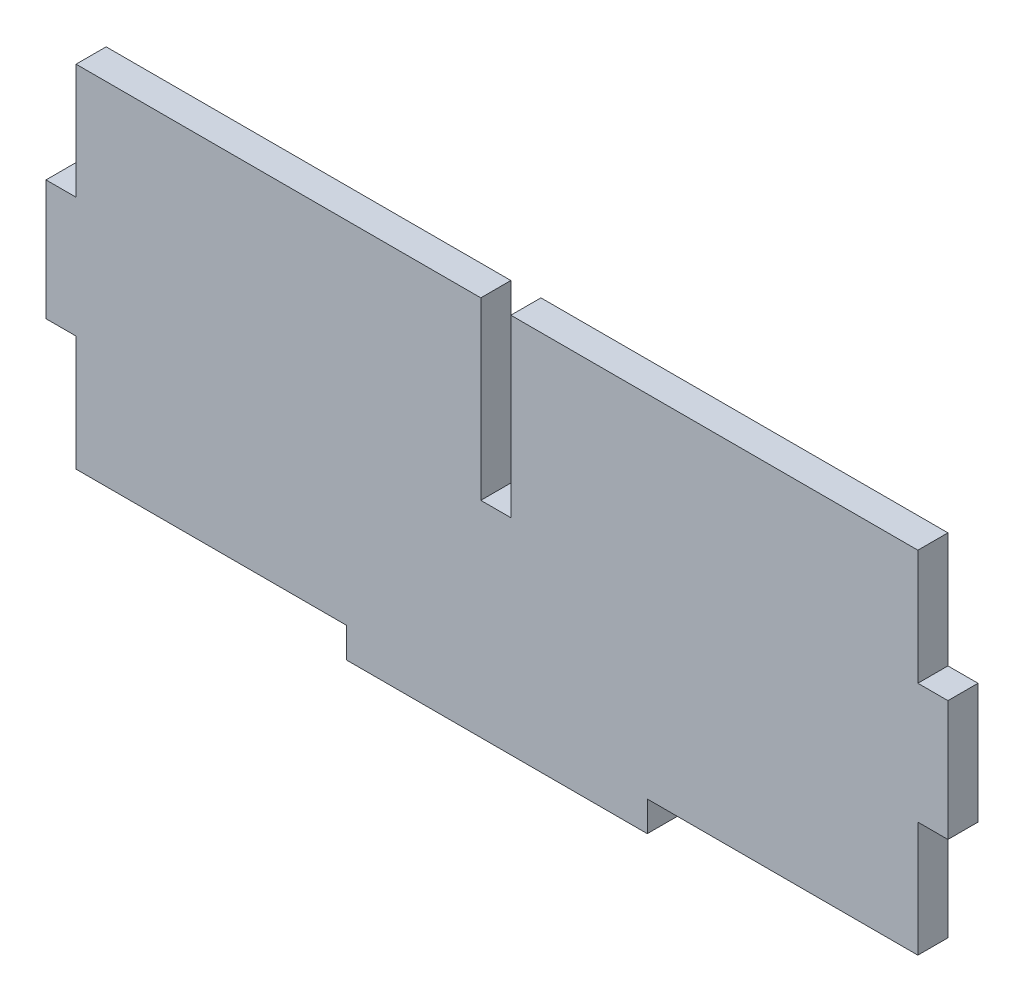
ISO-10303-21;
HEADER;
FILE_DESCRIPTION(('STEP AP214'),'2;1');
FILE_NAME('part.step','',(''),(''),'','','');
FILE_SCHEMA(('AUTOMOTIVE_DESIGN { 1 0 10303 214 1 1 1 1 }'));
ENDSEC;
DATA;
#1=APPLICATION_CONTEXT('core data for automotive mechanical design processes');
#2=APPLICATION_PROTOCOL_DEFINITION('international standard','automotive_design',2000,#1);
#3=PRODUCT_CONTEXT('',#1,'mechanical');
#4=PRODUCT('Part','Part','',(#3));
#5=PRODUCT_RELATED_PRODUCT_CATEGORY('part','',(#4));
#6=PRODUCT_DEFINITION_FORMATION('','',#4);
#7=PRODUCT_DEFINITION_CONTEXT('part definition',#1,'design');
#8=PRODUCT_DEFINITION('design','',#6,#7);
#9=PRODUCT_DEFINITION_SHAPE('','',#8);
#10=(LENGTH_UNIT() NAMED_UNIT(*) SI_UNIT(.MILLI.,.METRE.));
#11=(NAMED_UNIT(*) PLANE_ANGLE_UNIT() SI_UNIT($,.RADIAN.));
#12=(NAMED_UNIT(*) SI_UNIT($,.STERADIAN.) SOLID_ANGLE_UNIT());
#13=UNCERTAINTY_MEASURE_WITH_UNIT(LENGTH_MEASURE(1.E-05),#10,'distance_accuracy_value','');
#14=(GEOMETRIC_REPRESENTATION_CONTEXT(3) GLOBAL_UNCERTAINTY_ASSIGNED_CONTEXT((#13)) GLOBAL_UNIT_ASSIGNED_CONTEXT((#10,
#11,#12)) REPRESENTATION_CONTEXT('',''));
#15=CARTESIAN_POINT('',(0.,0.,0.));
#16=DIRECTION('',(0.,0.,1.));
#17=DIRECTION('',(1.,0.,0.));
#18=AXIS2_PLACEMENT_3D('',#15,#16,#17);
#19=CARTESIAN_POINT('',(1.38702054479395,0.,3.));
#20=DIRECTION('',(-1.,0.,0.));
#21=DIRECTION('',(0.,0.,1.));
#22=AXIS2_PLACEMENT_3D('',#19,#20,#21);
#23=PLANE('',#22);
#24=DIRECTION('',(0.,1.,0.));
#25=VECTOR('',#24,1.);
#26=CARTESIAN_POINT('',(1.38702054479395,0.,0.));
#27=LINE('',#26,#25);
#28=CARTESIAN_POINT('',(1.38702054479395,1.5,0.));
#29=VERTEX_POINT('',#28);
#30=CARTESIAN_POINT('',(1.38702054479395,19.,0.));
#31=VERTEX_POINT('',#30);
#32=EDGE_CURVE('E201',#29,#31,#27,.T.);
#33=ORIENTED_EDGE('',*,*,#32,.F.);
#34=DIRECTION('',(0.,0.,-1.));
#35=VECTOR('',#34,1.);
#36=CARTESIAN_POINT('',(1.38702054479395,1.5,3.));
#37=LINE('',#36,#35);
#38=CARTESIAN_POINT('',(1.38702054479395,1.5,3.));
#39=VERTEX_POINT('',#38);
#40=EDGE_CURVE('E11',#39,#29,#37,.T.);
#41=ORIENTED_EDGE('',*,*,#40,.F.);
#42=DIRECTION('',(0.,1.,0.));
#43=VECTOR('',#42,1.);
#44=CARTESIAN_POINT('',(1.38702054479395,0.,3.));
#45=LINE('',#44,#43);
#46=CARTESIAN_POINT('',(1.38702054479395,19.,3.));
#47=VERTEX_POINT('',#46);
#48=EDGE_CURVE('E301',#39,#47,#45,.T.);
#49=ORIENTED_EDGE('',*,*,#48,.T.);
#50=DIRECTION('',(0.,0.,-1.));
#51=VECTOR('',#50,1.);
#52=CARTESIAN_POINT('',(1.38702054479395,19.,3.));
#53=LINE('',#52,#51);
#54=EDGE_CURVE('E50',#47,#31,#53,.T.);
#55=ORIENTED_EDGE('',*,*,#54,.T.);
#56=EDGE_LOOP('',(#33,#41,#49,#55));
#57=FACE_BOUND('',#56,.T.);
#58=ADVANCED_FACE('F34',(#57),#23,.T.);
#59=CARTESIAN_POINT('',(0.,1.5,3.));
#60=DIRECTION('',(0.,1.,0.));
#61=DIRECTION('',(0.,0.,1.));
#62=AXIS2_PLACEMENT_3D('',#59,#60,#61);
#63=PLANE('',#62);
#64=DIRECTION('',(1.,0.,0.));
#65=VECTOR('',#64,1.);
#66=CARTESIAN_POINT('',(0.,1.5,0.));
#67=LINE('',#66,#65);
#68=CARTESIAN_POINT('',(-1.61297945520605,1.5,0.));
#69=VERTEX_POINT('',#68);
#70=EDGE_CURVE('E203',#69,#29,#67,.T.);
#71=ORIENTED_EDGE('',*,*,#70,.F.);
#72=DIRECTION('',(0.,0.,-1.));
#73=VECTOR('',#72,1.);
#74=CARTESIAN_POINT('',(-1.61297945520605,1.5,3.));
#75=LINE('',#74,#73);
#76=CARTESIAN_POINT('',(-1.61297945520605,1.5,3.));
#77=VERTEX_POINT('',#76);
#78=EDGE_CURVE('E42',#77,#69,#75,.T.);
#79=ORIENTED_EDGE('',*,*,#78,.F.);
#80=DIRECTION('',(1.,0.,0.));
#81=VECTOR('',#80,1.);
#82=CARTESIAN_POINT('',(0.,1.5,3.));
#83=LINE('',#82,#81);
#84=EDGE_CURVE('E298',#77,#39,#83,.T.);
#85=ORIENTED_EDGE('',*,*,#84,.T.);
#86=ORIENTED_EDGE('',*,*,#40,.T.);
#87=EDGE_LOOP('',(#71,#79,#85,#86));
#88=FACE_BOUND('',#87,.T.);
#89=ADVANCED_FACE('F297',(#88),#63,.T.);
#90=CARTESIAN_POINT('',(-1.61297945520605,0.,3.));
#91=DIRECTION('',(-1.,0.,0.));
#92=DIRECTION('',(0.,0.,1.));
#93=AXIS2_PLACEMENT_3D('',#90,#91,#92);
#94=PLANE('',#93);
#95=DIRECTION('',(0.,1.,0.));
#96=VECTOR('',#95,1.);
#97=CARTESIAN_POINT('',(-1.61297945520605,0.,0.));
#98=LINE('',#97,#96);
#99=CARTESIAN_POINT('',(-1.61297945520605,19.,0.));
#100=VERTEX_POINT('',#99);
#101=EDGE_CURVE('E206',#69,#100,#98,.T.);
#102=ORIENTED_EDGE('',*,*,#101,.T.);
#103=DIRECTION('',(0.,0.,-1.));
#104=VECTOR('',#103,1.);
#105=CARTESIAN_POINT('',(-1.61297945520605,19.,3.));
#106=LINE('',#105,#104);
#107=CARTESIAN_POINT('',(-1.61297945520605,19.,3.));
#108=VERTEX_POINT('',#107);
#109=EDGE_CURVE('E283',#108,#100,#106,.T.);
#110=ORIENTED_EDGE('',*,*,#109,.F.);
#111=DIRECTION('',(0.,1.,0.));
#112=VECTOR('',#111,1.);
#113=CARTESIAN_POINT('',(-1.61297945520605,0.,3.));
#114=LINE('',#113,#112);
#115=EDGE_CURVE('E289',#77,#108,#114,.T.);
#116=ORIENTED_EDGE('',*,*,#115,.F.);
#117=ORIENTED_EDGE('',*,*,#78,.T.);
#118=EDGE_LOOP('',(#102,#110,#116,#117));
#119=FACE_BOUND('',#118,.T.);
#120=ADVANCED_FACE('F287',(#119),#94,.F.);
#121=CARTESIAN_POINT('',(0.,19.,3.));
#122=DIRECTION('',(0.,1.,0.));
#123=DIRECTION('',(0.,0.,1.));
#124=AXIS2_PLACEMENT_3D('',#121,#122,#123);
#125=PLANE('',#124);
#126=DIRECTION('',(1.,0.,0.));
#127=VECTOR('',#126,1.);
#128=CARTESIAN_POINT('',(0.,19.,0.));
#129=LINE('',#128,#127);
#130=CARTESIAN_POINT('',(-42.,19.,0.));
#131=VERTEX_POINT('',#130);
#132=EDGE_CURVE('E209',#131,#100,#129,.T.);
#133=ORIENTED_EDGE('',*,*,#132,.F.);
#134=DIRECTION('',(0.,0.,-1.));
#135=VECTOR('',#134,1.);
#136=CARTESIAN_POINT('',(-42.,19.,3.));
#137=LINE('',#136,#135);
#138=CARTESIAN_POINT('',(-42.,19.,3.));
#139=VERTEX_POINT('',#138);
#140=EDGE_CURVE('E281',#139,#131,#137,.T.);
#141=ORIENTED_EDGE('',*,*,#140,.F.);
#142=DIRECTION('',(1.,0.,0.));
#143=VECTOR('',#142,1.);
#144=CARTESIAN_POINT('',(0.,19.,3.));
#145=LINE('',#144,#143);
#146=EDGE_CURVE('E198',#139,#108,#145,.T.);
#147=ORIENTED_EDGE('',*,*,#146,.T.);
#148=ORIENTED_EDGE('',*,*,#109,.T.);
#149=EDGE_LOOP('',(#133,#141,#147,#148));
#150=FACE_BOUND('',#149,.T.);
#151=ADVANCED_FACE('F367',(#150),#125,.T.);
#152=CARTESIAN_POINT('',(-42.,0.,3.));
#153=DIRECTION('',(-1.,0.,0.));
#154=DIRECTION('',(0.,0.,1.));
#155=AXIS2_PLACEMENT_3D('',#152,#153,#154);
#156=PLANE('',#155);
#157=DIRECTION('',(0.,1.,0.));
#158=VECTOR('',#157,1.);
#159=CARTESIAN_POINT('',(-42.,0.,0.));
#160=LINE('',#159,#158);
#161=CARTESIAN_POINT('',(-42.,7.5,0.));
#162=VERTEX_POINT('',#161);
#163=EDGE_CURVE('E212',#162,#131,#160,.T.);
#164=ORIENTED_EDGE('',*,*,#163,.F.);
#165=DIRECTION('',(0.,0.,-1.));
#166=VECTOR('',#165,1.);
#167=CARTESIAN_POINT('',(-42.,7.5,3.));
#168=LINE('',#167,#166);
#169=CARTESIAN_POINT('',(-42.,7.5,3.));
#170=VERTEX_POINT('',#169);
#171=EDGE_CURVE('E279',#170,#162,#168,.T.);
#172=ORIENTED_EDGE('',*,*,#171,.F.);
#173=DIRECTION('',(0.,1.,0.));
#174=VECTOR('',#173,1.);
#175=CARTESIAN_POINT('',(-42.,0.,3.));
#176=LINE('',#175,#174);
#177=EDGE_CURVE('E307',#170,#139,#176,.T.);
#178=ORIENTED_EDGE('',*,*,#177,.T.);
#179=ORIENTED_EDGE('',*,*,#140,.T.);
#180=EDGE_LOOP('',(#164,#172,#178,#179));
#181=FACE_BOUND('',#180,.T.);
#182=ADVANCED_FACE('F370',(#181),#156,.T.);
#183=CARTESIAN_POINT('',(0.,7.50000000000002,3.));
#184=DIRECTION('',(0.,1.,0.));
#185=DIRECTION('',(-1.,0.,0.));
#186=AXIS2_PLACEMENT_3D('',#183,#184,#185);
#187=PLANE('',#186);
#188=DIRECTION('',(1.,0.,0.));
#189=VECTOR('',#188,1.);
#190=CARTESIAN_POINT('',(0.,7.50000000000002,0.));
#191=LINE('',#190,#189);
#192=CARTESIAN_POINT('',(-45.,7.5,0.));
#193=VERTEX_POINT('',#192);
#194=EDGE_CURVE('E216',#193,#162,#191,.T.);
#195=ORIENTED_EDGE('',*,*,#194,.F.);
#196=DIRECTION('',(0.,0.,-1.));
#197=VECTOR('',#196,1.);
#198=CARTESIAN_POINT('',(-45.,7.5,3.));
#199=LINE('',#198,#197);
#200=CARTESIAN_POINT('',(-45.,7.5,3.));
#201=VERTEX_POINT('',#200);
#202=EDGE_CURVE('E277',#201,#193,#199,.T.);
#203=ORIENTED_EDGE('',*,*,#202,.F.);
#204=DIRECTION('',(1.,0.,0.));
#205=VECTOR('',#204,1.);
#206=CARTESIAN_POINT('',(0.,7.50000000000002,3.));
#207=LINE('',#206,#205);
#208=EDGE_CURVE('E310',#201,#170,#207,.T.);
#209=ORIENTED_EDGE('',*,*,#208,.T.);
#210=ORIENTED_EDGE('',*,*,#171,.T.);
#211=EDGE_LOOP('',(#195,#203,#209,#210));
#212=FACE_BOUND('',#211,.T.);
#213=ADVANCED_FACE('F373',(#212),#187,.T.);
#214=CARTESIAN_POINT('',(-45.,0.,3.));
#215=DIRECTION('',(-1.,0.,0.));
#216=DIRECTION('',(0.,0.,1.));
#217=AXIS2_PLACEMENT_3D('',#214,#215,#216);
#218=PLANE('',#217);
#219=DIRECTION('',(0.,1.,0.));
#220=VECTOR('',#219,1.);
#221=CARTESIAN_POINT('',(-45.,0.,0.));
#222=LINE('',#221,#220);
#223=CARTESIAN_POINT('',(-45.,-4.5,0.));
#224=VERTEX_POINT('',#223);
#225=EDGE_CURVE('E219',#224,#193,#222,.T.);
#226=ORIENTED_EDGE('',*,*,#225,.F.);
#227=DIRECTION('',(0.,0.,-1.));
#228=VECTOR('',#227,1.);
#229=CARTESIAN_POINT('',(-45.,-4.5,3.));
#230=LINE('',#229,#228);
#231=CARTESIAN_POINT('',(-45.,-4.5,3.));
#232=VERTEX_POINT('',#231);
#233=EDGE_CURVE('E275',#232,#224,#230,.T.);
#234=ORIENTED_EDGE('',*,*,#233,.F.);
#235=DIRECTION('',(0.,1.,0.));
#236=VECTOR('',#235,1.);
#237=CARTESIAN_POINT('',(-45.,0.,3.));
#238=LINE('',#237,#236);
#239=EDGE_CURVE('E313',#232,#201,#238,.T.);
#240=ORIENTED_EDGE('',*,*,#239,.T.);
#241=ORIENTED_EDGE('',*,*,#202,.T.);
#242=EDGE_LOOP('',(#226,#234,#240,#241));
#243=FACE_BOUND('',#242,.T.);
#244=ADVANCED_FACE('F377',(#243),#218,.T.);
#245=CARTESIAN_POINT('',(0.,-4.49999999999998,3.));
#246=DIRECTION('',(0.,-1.,0.));
#247=DIRECTION('',(1.,0.,0.));
#248=AXIS2_PLACEMENT_3D('',#245,#246,#247);
#249=PLANE('',#248);
#250=DIRECTION('',(-1.,0.,0.));
#251=VECTOR('',#250,1.);
#252=CARTESIAN_POINT('',(0.,-4.49999999999998,0.));
#253=LINE('',#252,#251);
#254=CARTESIAN_POINT('',(-42.,-4.5,0.));
#255=VERTEX_POINT('',#254);
#256=EDGE_CURVE('E222',#255,#224,#253,.T.);
#257=ORIENTED_EDGE('',*,*,#256,.F.);
#258=DIRECTION('',(0.,0.,-1.));
#259=VECTOR('',#258,1.);
#260=CARTESIAN_POINT('',(-42.,-4.5,3.));
#261=LINE('',#260,#259);
#262=CARTESIAN_POINT('',(-42.,-4.5,3.));
#263=VERTEX_POINT('',#262);
#264=EDGE_CURVE('E273',#263,#255,#261,.T.);
#265=ORIENTED_EDGE('',*,*,#264,.F.);
#266=DIRECTION('',(-1.,0.,0.));
#267=VECTOR('',#266,1.);
#268=CARTESIAN_POINT('',(0.,-4.49999999999998,3.));
#269=LINE('',#268,#267);
#270=EDGE_CURVE('E316',#263,#232,#269,.T.);
#271=ORIENTED_EDGE('',*,*,#270,.T.);
#272=ORIENTED_EDGE('',*,*,#233,.T.);
#273=EDGE_LOOP('',(#257,#265,#271,#272));
#274=FACE_BOUND('',#273,.T.);
#275=ADVANCED_FACE('F381',(#274),#249,.T.);
#276=CARTESIAN_POINT('',(-42.,0.,3.));
#277=DIRECTION('',(-1.,0.,0.));
#278=DIRECTION('',(0.,0.,1.));
#279=AXIS2_PLACEMENT_3D('',#276,#277,#278);
#280=PLANE('',#279);
#281=DIRECTION('',(0.,1.,0.));
#282=VECTOR('',#281,1.);
#283=CARTESIAN_POINT('',(-42.,0.,0.));
#284=LINE('',#283,#282);
#285=CARTESIAN_POINT('',(-42.,-16.,0.));
#286=VERTEX_POINT('',#285);
#287=EDGE_CURVE('E225',#286,#255,#284,.T.);
#288=ORIENTED_EDGE('',*,*,#287,.F.);
#289=DIRECTION('',(0.,0.,-1.));
#290=VECTOR('',#289,1.);
#291=CARTESIAN_POINT('',(-42.,-16.,3.));
#292=LINE('',#291,#290);
#293=CARTESIAN_POINT('',(-42.,-16.,3.));
#294=VERTEX_POINT('',#293);
#295=EDGE_CURVE('E271',#294,#286,#292,.T.);
#296=ORIENTED_EDGE('',*,*,#295,.F.);
#297=DIRECTION('',(0.,1.,0.));
#298=VECTOR('',#297,1.);
#299=CARTESIAN_POINT('',(-42.,0.,3.));
#300=LINE('',#299,#298);
#301=EDGE_CURVE('E319',#294,#263,#300,.T.);
#302=ORIENTED_EDGE('',*,*,#301,.T.);
#303=ORIENTED_EDGE('',*,*,#264,.T.);
#304=EDGE_LOOP('',(#288,#296,#302,#303));
#305=FACE_BOUND('',#304,.T.);
#306=ADVANCED_FACE('F385',(#305),#280,.T.);
#307=CARTESIAN_POINT('',(0.,-16.,3.));
#308=DIRECTION('',(0.,1.,0.));
#309=DIRECTION('',(0.,0.,1.));
#310=AXIS2_PLACEMENT_3D('',#307,#308,#309);
#311=PLANE('',#310);
#312=DIRECTION('',(1.,0.,0.));
#313=VECTOR('',#312,1.);
#314=CARTESIAN_POINT('',(0.,-16.,0.));
#315=LINE('',#314,#313);
#316=CARTESIAN_POINT('',(-15.,-16.,0.));
#317=VERTEX_POINT('',#316);
#318=EDGE_CURVE('E228',#286,#317,#315,.T.);
#319=ORIENTED_EDGE('',*,*,#318,.T.);
#320=DIRECTION('',(0.,0.,-1.));
#321=VECTOR('',#320,1.);
#322=CARTESIAN_POINT('',(-15.,-16.,3.));
#323=LINE('',#322,#321);
#324=CARTESIAN_POINT('',(-15.,-16.,3.));
#325=VERTEX_POINT('',#324);
#326=EDGE_CURVE('E268',#325,#317,#323,.T.);
#327=ORIENTED_EDGE('',*,*,#326,.F.);
#328=DIRECTION('',(1.,0.,0.));
#329=VECTOR('',#328,1.);
#330=CARTESIAN_POINT('',(0.,-16.,3.));
#331=LINE('',#330,#329);
#332=EDGE_CURVE('E322',#294,#325,#331,.T.);
#333=ORIENTED_EDGE('',*,*,#332,.F.);
#334=ORIENTED_EDGE('',*,*,#295,.T.);
#335=EDGE_LOOP('',(#319,#327,#333,#334));
#336=FACE_BOUND('',#335,.T.);
#337=ADVANCED_FACE('F389',(#336),#311,.F.);
#338=CARTESIAN_POINT('',(-15.,0.,3.));
#339=DIRECTION('',(1.,0.,0.));
#340=DIRECTION('',(0.,0.,-1.));
#341=AXIS2_PLACEMENT_3D('',#338,#339,#340);
#342=PLANE('',#341);
#343=DIRECTION('',(0.,-1.,0.));
#344=VECTOR('',#343,1.);
#345=CARTESIAN_POINT('',(-15.,0.,0.));
#346=LINE('',#345,#344);
#347=CARTESIAN_POINT('',(-15.,-19.,0.));
#348=VERTEX_POINT('',#347);
#349=EDGE_CURVE('E230',#317,#348,#346,.T.);
#350=ORIENTED_EDGE('',*,*,#349,.T.);
#351=DIRECTION('',(0.,0.,-1.));
#352=VECTOR('',#351,1.);
#353=CARTESIAN_POINT('',(-15.,-19.,3.));
#354=LINE('',#353,#352);
#355=CARTESIAN_POINT('',(-15.,-19.,3.));
#356=VERTEX_POINT('',#355);
#357=EDGE_CURVE('E265',#356,#348,#354,.T.);
#358=ORIENTED_EDGE('',*,*,#357,.F.);
#359=DIRECTION('',(0.,-1.,0.));
#360=VECTOR('',#359,1.);
#361=CARTESIAN_POINT('',(-15.,0.,3.));
#362=LINE('',#361,#360);
#363=EDGE_CURVE('E324',#325,#356,#362,.T.);
#364=ORIENTED_EDGE('',*,*,#363,.F.);
#365=ORIENTED_EDGE('',*,*,#326,.T.);
#366=EDGE_LOOP('',(#350,#358,#364,#365));
#367=FACE_BOUND('',#366,.T.);
#368=ADVANCED_FACE('F393',(#367),#342,.F.);
#369=CARTESIAN_POINT('',(0.,-19.,3.));
#370=DIRECTION('',(0.,1.,0.));
#371=DIRECTION('',(0.,0.,1.));
#372=AXIS2_PLACEMENT_3D('',#369,#370,#371);
#373=PLANE('',#372);
#374=DIRECTION('',(1.,0.,0.));
#375=VECTOR('',#374,1.);
#376=CARTESIAN_POINT('',(0.,-19.,0.));
#377=LINE('',#376,#375);
#378=CARTESIAN_POINT('',(15.,-19.,0.));
#379=VERTEX_POINT('',#378);
#380=EDGE_CURVE('E232',#348,#379,#377,.T.);
#381=ORIENTED_EDGE('',*,*,#380,.T.);
#382=DIRECTION('',(0.,0.,-1.));
#383=VECTOR('',#382,1.);
#384=CARTESIAN_POINT('',(15.,-19.,3.));
#385=LINE('',#384,#383);
#386=CARTESIAN_POINT('',(15.,-19.,3.));
#387=VERTEX_POINT('',#386);
#388=EDGE_CURVE('E263',#387,#379,#385,.T.);
#389=ORIENTED_EDGE('',*,*,#388,.F.);
#390=DIRECTION('',(1.,0.,0.));
#391=VECTOR('',#390,1.);
#392=CARTESIAN_POINT('',(0.,-19.,3.));
#393=LINE('',#392,#391);
#394=EDGE_CURVE('E326',#356,#387,#393,.T.);
#395=ORIENTED_EDGE('',*,*,#394,.F.);
#396=ORIENTED_EDGE('',*,*,#357,.T.);
#397=EDGE_LOOP('',(#381,#389,#395,#396));
#398=FACE_BOUND('',#397,.T.);
#399=ADVANCED_FACE('F397',(#398),#373,.F.);
#400=CARTESIAN_POINT('',(15.,0.,3.));
#401=DIRECTION('',(1.,0.,0.));
#402=DIRECTION('',(0.,0.,-1.));
#403=AXIS2_PLACEMENT_3D('',#400,#401,#402);
#404=PLANE('',#403);
#405=DIRECTION('',(0.,-1.,0.));
#406=VECTOR('',#405,1.);
#407=CARTESIAN_POINT('',(15.,0.,0.));
#408=LINE('',#407,#406);
#409=CARTESIAN_POINT('',(15.,-16.,0.));
#410=VERTEX_POINT('',#409);
#411=EDGE_CURVE('E235',#410,#379,#408,.T.);
#412=ORIENTED_EDGE('',*,*,#411,.F.);
#413=DIRECTION('',(0.,0.,-1.));
#414=VECTOR('',#413,1.);
#415=CARTESIAN_POINT('',(15.,-16.,3.));
#416=LINE('',#415,#414);
#417=CARTESIAN_POINT('',(15.,-16.,3.));
#418=VERTEX_POINT('',#417);
#419=EDGE_CURVE('E261',#418,#410,#416,.T.);
#420=ORIENTED_EDGE('',*,*,#419,.F.);
#421=DIRECTION('',(0.,-1.,0.));
#422=VECTOR('',#421,1.);
#423=CARTESIAN_POINT('',(15.,0.,3.));
#424=LINE('',#423,#422);
#425=EDGE_CURVE('E328',#418,#387,#424,.T.);
#426=ORIENTED_EDGE('',*,*,#425,.T.);
#427=ORIENTED_EDGE('',*,*,#388,.T.);
#428=EDGE_LOOP('',(#412,#420,#426,#427));
#429=FACE_BOUND('',#428,.T.);
#430=ADVANCED_FACE('F401',(#429),#404,.T.);
#431=CARTESIAN_POINT('',(0.,-16.,3.));
#432=DIRECTION('',(0.,-1.,0.));
#433=DIRECTION('',(1.,0.,0.));
#434=AXIS2_PLACEMENT_3D('',#431,#432,#433);
#435=PLANE('',#434);
#436=DIRECTION('',(-1.,0.,0.));
#437=VECTOR('',#436,1.);
#438=CARTESIAN_POINT('',(0.,-16.,0.));
#439=LINE('',#438,#437);
#440=CARTESIAN_POINT('',(42.,-16.,0.));
#441=VERTEX_POINT('',#440);
#442=EDGE_CURVE('E238',#441,#410,#439,.T.);
#443=ORIENTED_EDGE('',*,*,#442,.F.);
#444=DIRECTION('',(0.,0.,-1.));
#445=VECTOR('',#444,1.);
#446=CARTESIAN_POINT('',(42.,-16.,3.));
#447=LINE('',#446,#445);
#448=CARTESIAN_POINT('',(42.,-16.,3.));
#449=VERTEX_POINT('',#448);
#450=EDGE_CURVE('E259',#449,#441,#447,.T.);
#451=ORIENTED_EDGE('',*,*,#450,.F.);
#452=DIRECTION('',(-1.,0.,0.));
#453=VECTOR('',#452,1.);
#454=CARTESIAN_POINT('',(0.,-16.,3.));
#455=LINE('',#454,#453);
#456=EDGE_CURVE('E331',#449,#418,#455,.T.);
#457=ORIENTED_EDGE('',*,*,#456,.T.);
#458=ORIENTED_EDGE('',*,*,#419,.T.);
#459=EDGE_LOOP('',(#443,#451,#457,#458));
#460=FACE_BOUND('',#459,.T.);
#461=ADVANCED_FACE('F405',(#460),#435,.T.);
#462=CARTESIAN_POINT('',(42.,0.,3.));
#463=DIRECTION('',(1.,0.,0.));
#464=DIRECTION('',(0.,0.,-1.));
#465=AXIS2_PLACEMENT_3D('',#462,#463,#464);
#466=PLANE('',#465);
#467=DIRECTION('',(0.,-1.,0.));
#468=VECTOR('',#467,1.);
#469=CARTESIAN_POINT('',(42.,0.,0.));
#470=LINE('',#469,#468);
#471=CARTESIAN_POINT('',(42.,-4.5,0.));
#472=VERTEX_POINT('',#471);
#473=EDGE_CURVE('E241',#472,#441,#470,.T.);
#474=ORIENTED_EDGE('',*,*,#473,.F.);
#475=DIRECTION('',(0.,0.,-1.));
#476=VECTOR('',#475,1.);
#477=CARTESIAN_POINT('',(42.,-4.5,3.));
#478=LINE('',#477,#476);
#479=CARTESIAN_POINT('',(42.,-4.5,3.));
#480=VERTEX_POINT('',#479);
#481=EDGE_CURVE('E257',#480,#472,#478,.T.);
#482=ORIENTED_EDGE('',*,*,#481,.F.);
#483=DIRECTION('',(0.,-1.,0.));
#484=VECTOR('',#483,1.);
#485=CARTESIAN_POINT('',(42.,0.,3.));
#486=LINE('',#485,#484);
#487=EDGE_CURVE('E334',#480,#449,#486,.T.);
#488=ORIENTED_EDGE('',*,*,#487,.T.);
#489=ORIENTED_EDGE('',*,*,#450,.T.);
#490=EDGE_LOOP('',(#474,#482,#488,#489));
#491=FACE_BOUND('',#490,.T.);
#492=ADVANCED_FACE('F347',(#491),#466,.T.);
#493=CARTESIAN_POINT('',(0.,-4.5,3.));
#494=DIRECTION('',(0.,-1.,0.));
#495=DIRECTION('',(0.,0.,-1.));
#496=AXIS2_PLACEMENT_3D('',#493,#494,#495);
#497=PLANE('',#496);
#498=DIRECTION('',(-1.,0.,0.));
#499=VECTOR('',#498,1.);
#500=CARTESIAN_POINT('',(0.,-4.5,0.));
#501=LINE('',#500,#499);
#502=CARTESIAN_POINT('',(45.,-4.5,0.));
#503=VERTEX_POINT('',#502);
#504=EDGE_CURVE('E244',#503,#472,#501,.T.);
#505=ORIENTED_EDGE('',*,*,#504,.F.);
#506=DIRECTION('',(0.,0.,-1.));
#507=VECTOR('',#506,1.);
#508=CARTESIAN_POINT('',(45.,-4.5,3.));
#509=LINE('',#508,#507);
#510=CARTESIAN_POINT('',(45.,-4.5,3.));
#511=VERTEX_POINT('',#510);
#512=EDGE_CURVE('E255',#511,#503,#509,.T.);
#513=ORIENTED_EDGE('',*,*,#512,.F.);
#514=DIRECTION('',(-1.,0.,0.));
#515=VECTOR('',#514,1.);
#516=CARTESIAN_POINT('',(0.,-4.5,3.));
#517=LINE('',#516,#515);
#518=EDGE_CURVE('E337',#511,#480,#517,.T.);
#519=ORIENTED_EDGE('',*,*,#518,.T.);
#520=ORIENTED_EDGE('',*,*,#481,.T.);
#521=EDGE_LOOP('',(#505,#513,#519,#520));
#522=FACE_BOUND('',#521,.T.);
#523=ADVANCED_FACE('F341',(#522),#497,.T.);
#524=CARTESIAN_POINT('',(45.,0.,3.));
#525=DIRECTION('',(-1.,0.,0.));
#526=DIRECTION('',(0.,0.,1.));
#527=AXIS2_PLACEMENT_3D('',#524,#525,#526);
#528=PLANE('',#527);
#529=DIRECTION('',(0.,1.,0.));
#530=VECTOR('',#529,1.);
#531=CARTESIAN_POINT('',(45.,0.,0.));
#532=LINE('',#531,#530);
#533=CARTESIAN_POINT('',(45.,7.50000000000001,0.));
#534=VERTEX_POINT('',#533);
#535=EDGE_CURVE('E247',#503,#534,#532,.T.);
#536=ORIENTED_EDGE('',*,*,#535,.T.);
#537=DIRECTION('',(0.,0.,-1.));
#538=VECTOR('',#537,1.);
#539=CARTESIAN_POINT('',(45.,7.50000000000001,3.));
#540=LINE('',#539,#538);
#541=CARTESIAN_POINT('',(45.,7.50000000000001,3.));
#542=VERTEX_POINT('',#541);
#543=EDGE_CURVE('E192',#542,#534,#540,.T.);
#544=ORIENTED_EDGE('',*,*,#543,.F.);
#545=DIRECTION('',(0.,1.,0.));
#546=VECTOR('',#545,1.);
#547=CARTESIAN_POINT('',(45.,0.,3.));
#548=LINE('',#547,#546);
#549=EDGE_CURVE('E180',#511,#542,#548,.T.);
#550=ORIENTED_EDGE('',*,*,#549,.F.);
#551=ORIENTED_EDGE('',*,*,#512,.T.);
#552=EDGE_LOOP('',(#536,#544,#550,#551));
#553=FACE_BOUND('',#552,.T.);
#554=ADVANCED_FACE('F351',(#553),#528,.F.);
#555=CARTESIAN_POINT('',(0.,7.50000000000001,3.));
#556=DIRECTION('',(0.,-1.,0.));
#557=DIRECTION('',(0.,0.,-1.));
#558=AXIS2_PLACEMENT_3D('',#555,#556,#557);
#559=PLANE('',#558);
#560=DIRECTION('',(-1.,0.,0.));
#561=VECTOR('',#560,1.);
#562=CARTESIAN_POINT('',(0.,7.50000000000001,0.));
#563=LINE('',#562,#561);
#564=CARTESIAN_POINT('',(42.,7.50000000000001,0.));
#565=VERTEX_POINT('',#564);
#566=EDGE_CURVE('E189',#534,#565,#563,.T.);
#567=ORIENTED_EDGE('',*,*,#566,.T.);
#568=DIRECTION('',(0.,0.,-1.));
#569=VECTOR('',#568,1.);
#570=CARTESIAN_POINT('',(42.,7.50000000000001,3.));
#571=LINE('',#570,#569);
#572=CARTESIAN_POINT('',(42.,7.50000000000001,3.));
#573=VERTEX_POINT('',#572);
#574=EDGE_CURVE('E186',#573,#565,#571,.T.);
#575=ORIENTED_EDGE('',*,*,#574,.F.);
#576=DIRECTION('',(-1.,0.,0.));
#577=VECTOR('',#576,1.);
#578=CARTESIAN_POINT('',(0.,7.50000000000001,3.));
#579=LINE('',#578,#577);
#580=EDGE_CURVE('E172',#542,#573,#579,.T.);
#581=ORIENTED_EDGE('',*,*,#580,.F.);
#582=ORIENTED_EDGE('',*,*,#543,.T.);
#583=EDGE_LOOP('',(#567,#575,#581,#582));
#584=FACE_BOUND('',#583,.T.);
#585=ADVANCED_FACE('F187',(#584),#559,.F.);
#586=CARTESIAN_POINT('',(42.,0.,3.));
#587=DIRECTION('',(-1.,0.,0.));
#588=DIRECTION('',(0.,-1.,0.));
#589=AXIS2_PLACEMENT_3D('',#586,#587,#588);
#590=PLANE('',#589);
#591=DIRECTION('',(0.,1.,0.));
#592=VECTOR('',#591,1.);
#593=CARTESIAN_POINT('',(42.,0.,0.));
#594=LINE('',#593,#592);
#595=CARTESIAN_POINT('',(42.,19.,0.));
#596=VERTEX_POINT('',#595);
#597=EDGE_CURVE('E250',#565,#596,#594,.T.);
#598=ORIENTED_EDGE('',*,*,#597,.T.);
#599=DIRECTION('',(0.,0.,-1.));
#600=VECTOR('',#599,1.);
#601=CARTESIAN_POINT('',(42.,19.,3.));
#602=LINE('',#601,#600);
#603=CARTESIAN_POINT('',(42.,19.,3.));
#604=VERTEX_POINT('',#603);
#605=EDGE_CURVE('E112',#604,#596,#602,.T.);
#606=ORIENTED_EDGE('',*,*,#605,.F.);
#607=DIRECTION('',(0.,1.,0.));
#608=VECTOR('',#607,1.);
#609=CARTESIAN_POINT('',(42.,0.,3.));
#610=LINE('',#609,#608);
#611=EDGE_CURVE('E177',#573,#604,#610,.T.);
#612=ORIENTED_EDGE('',*,*,#611,.F.);
#613=ORIENTED_EDGE('',*,*,#574,.T.);
#614=EDGE_LOOP('',(#598,#606,#612,#613));
#615=FACE_BOUND('',#614,.T.);
#616=ADVANCED_FACE('F194',(#615),#590,.F.);
#617=EDGE_CURVE('E213',#31,#596,#129,.T.);
#618=ORIENTED_EDGE('',*,*,#617,.F.);
#619=ORIENTED_EDGE('',*,*,#54,.F.);
#620=EDGE_CURVE('E195',#47,#604,#145,.T.);
#621=ORIENTED_EDGE('',*,*,#620,.T.);
#622=ORIENTED_EDGE('',*,*,#605,.T.);
#623=EDGE_LOOP('',(#618,#619,#621,#622));
#624=FACE_BOUND('',#623,.T.);
#625=ADVANCED_FACE('F300',(#624),#125,.T.);
#626=CARTESIAN_POINT('',(0.,0.,3.));
#627=DIRECTION('',(0.,0.,1.));
#628=DIRECTION('',(1.,0.,0.));
#629=AXIS2_PLACEMENT_3D('',#626,#627,#628);
#630=PLANE('',#629);
#631=ORIENTED_EDGE('',*,*,#48,.F.);
#632=ORIENTED_EDGE('',*,*,#84,.F.);
#633=ORIENTED_EDGE('',*,*,#115,.T.);
#634=ORIENTED_EDGE('',*,*,#146,.F.);
#635=ORIENTED_EDGE('',*,*,#177,.F.);
#636=ORIENTED_EDGE('',*,*,#208,.F.);
#637=ORIENTED_EDGE('',*,*,#239,.F.);
#638=ORIENTED_EDGE('',*,*,#270,.F.);
#639=ORIENTED_EDGE('',*,*,#301,.F.);
#640=ORIENTED_EDGE('',*,*,#332,.T.);
#641=ORIENTED_EDGE('',*,*,#363,.T.);
#642=ORIENTED_EDGE('',*,*,#394,.T.);
#643=ORIENTED_EDGE('',*,*,#425,.F.);
#644=ORIENTED_EDGE('',*,*,#456,.F.);
#645=ORIENTED_EDGE('',*,*,#487,.F.);
#646=ORIENTED_EDGE('',*,*,#518,.F.);
#647=ORIENTED_EDGE('',*,*,#549,.T.);
#648=ORIENTED_EDGE('',*,*,#580,.T.);
#649=ORIENTED_EDGE('',*,*,#611,.T.);
#650=ORIENTED_EDGE('',*,*,#620,.F.);
#651=EDGE_LOOP('',(#631,#632,#633,#634,#635,#636,#637,#638,#639,#640,#641,#642,#643,#644,#645,
#646,#647,#648,#649,#650));
#652=FACE_BOUND('',#651,.T.);
#653=ADVANCED_FACE('F174',(#652),#630,.T.);
#654=CARTESIAN_POINT('',(0.,0.,0.));
#655=DIRECTION('',(0.,0.,1.));
#656=DIRECTION('',(1.,0.,0.));
#657=AXIS2_PLACEMENT_3D('',#654,#655,#656);
#658=PLANE('',#657);
#659=ORIENTED_EDGE('',*,*,#32,.T.);
#660=ORIENTED_EDGE('',*,*,#617,.T.);
#661=ORIENTED_EDGE('',*,*,#597,.F.);
#662=ORIENTED_EDGE('',*,*,#566,.F.);
#663=ORIENTED_EDGE('',*,*,#535,.F.);
#664=ORIENTED_EDGE('',*,*,#504,.T.);
#665=ORIENTED_EDGE('',*,*,#473,.T.);
#666=ORIENTED_EDGE('',*,*,#442,.T.);
#667=ORIENTED_EDGE('',*,*,#411,.T.);
#668=ORIENTED_EDGE('',*,*,#380,.F.);
#669=ORIENTED_EDGE('',*,*,#349,.F.);
#670=ORIENTED_EDGE('',*,*,#318,.F.);
#671=ORIENTED_EDGE('',*,*,#287,.T.);
#672=ORIENTED_EDGE('',*,*,#256,.T.);
#673=ORIENTED_EDGE('',*,*,#225,.T.);
#674=ORIENTED_EDGE('',*,*,#194,.T.);
#675=ORIENTED_EDGE('',*,*,#163,.T.);
#676=ORIENTED_EDGE('',*,*,#132,.T.);
#677=ORIENTED_EDGE('',*,*,#101,.F.);
#678=ORIENTED_EDGE('',*,*,#70,.T.);
#679=EDGE_LOOP('',(#659,#660,#661,#662,#663,#664,#665,#666,#667,#668,#669,#670,#671,#672,#673,
#674,#675,#676,#677,#678));
#680=FACE_BOUND('',#679,.T.);
#681=ADVANCED_FACE('F295',(#680),#658,.F.);
#682=CLOSED_SHELL('',(#58,#89,#120,#151,#182,#213,#244,#275,#306,#337,#368,#399,#430,#461,#492,
#523,#554,#585,#616,#625,#653,#681));
#683=MANIFOLD_SOLID_BREP('B2',#682);
#684=ADVANCED_BREP_SHAPE_REPRESENTATION('',(#18,#683),#14);
#685=SHAPE_DEFINITION_REPRESENTATION(#9,#684);
ENDSEC;
END-ISO-10303-21;
